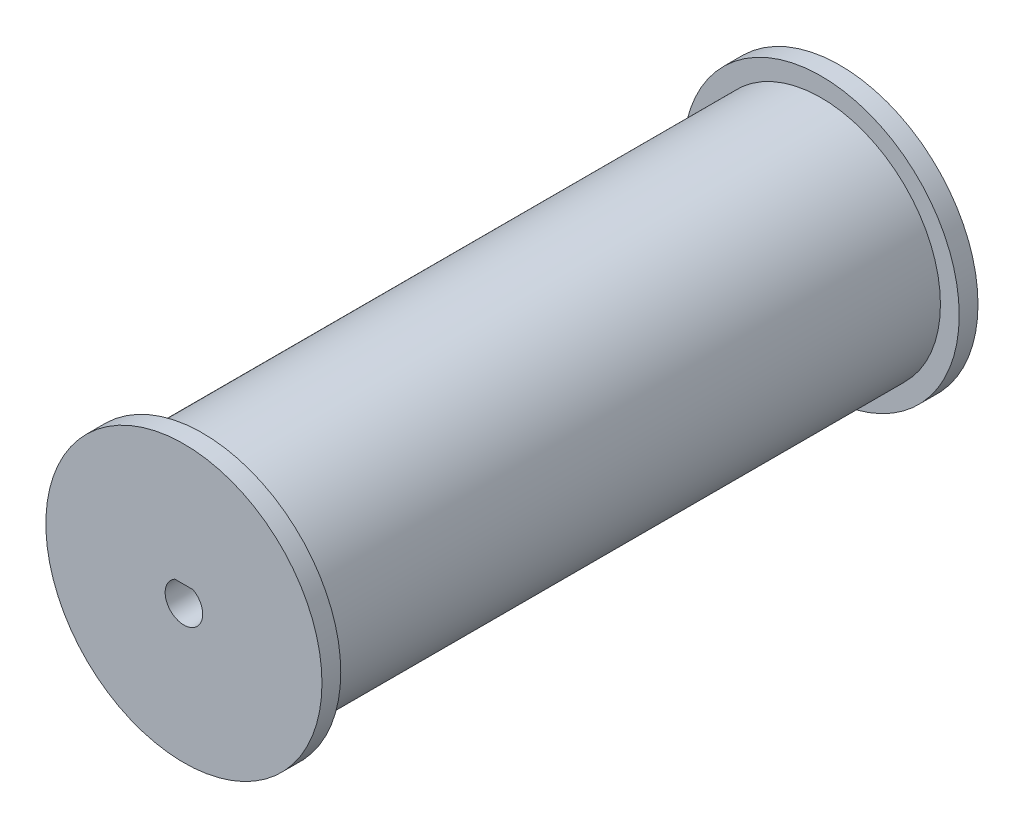
ISO-10303-21;
HEADER;
FILE_DESCRIPTION(('STEP AP214'),'2;1');
FILE_NAME('part.step','',(''),(''),'','','');
FILE_SCHEMA(('AUTOMOTIVE_DESIGN { 1 0 10303 214 1 1 1 1 }'));
ENDSEC;
DATA;
#1=APPLICATION_CONTEXT('core data for automotive mechanical design processes');
#2=APPLICATION_PROTOCOL_DEFINITION('international standard','automotive_design',2000,#1);
#3=PRODUCT_CONTEXT('',#1,'mechanical');
#4=PRODUCT('Part','Part','',(#3));
#5=PRODUCT_RELATED_PRODUCT_CATEGORY('part','',(#4));
#6=PRODUCT_DEFINITION_FORMATION('','',#4);
#7=PRODUCT_DEFINITION_CONTEXT('part definition',#1,'design');
#8=PRODUCT_DEFINITION('design','',#6,#7);
#9=PRODUCT_DEFINITION_SHAPE('','',#8);
#10=(LENGTH_UNIT() NAMED_UNIT(*) SI_UNIT(.MILLI.,.METRE.));
#11=(NAMED_UNIT(*) PLANE_ANGLE_UNIT() SI_UNIT($,.RADIAN.));
#12=(NAMED_UNIT(*) SI_UNIT($,.STERADIAN.) SOLID_ANGLE_UNIT());
#13=UNCERTAINTY_MEASURE_WITH_UNIT(LENGTH_MEASURE(1.E-05),#10,'distance_accuracy_value','');
#14=(GEOMETRIC_REPRESENTATION_CONTEXT(3) GLOBAL_UNCERTAINTY_ASSIGNED_CONTEXT((#13)) GLOBAL_UNIT_ASSIGNED_CONTEXT((#10,
#11,#12)) REPRESENTATION_CONTEXT('',''));
#15=CARTESIAN_POINT('',(0.,0.,0.));
#16=DIRECTION('',(0.,0.,1.));
#17=DIRECTION('',(1.,0.,0.));
#18=AXIS2_PLACEMENT_3D('',#15,#16,#17);
#19=CARTESIAN_POINT('',(0.,0.,69.85));
#20=DIRECTION('',(0.,0.,-1.));
#21=DIRECTION('',(-1.,0.,0.));
#22=AXIS2_PLACEMENT_3D('',#19,#20,#21);
#23=CYLINDRICAL_SURFACE('',#22,12.7);
#24=CARTESIAN_POINT('',(0.,0.,2.));
#25=DIRECTION('',(0.,0.,1.));
#26=DIRECTION('',(1.,0.,0.));
#27=AXIS2_PLACEMENT_3D('',#24,#25,#26);
#28=CIRCLE('',#27,12.7);
#29=CARTESIAN_POINT('',(12.7,0.,2.));
#30=VERTEX_POINT('',#29);
#31=EDGE_CURVE('E89',#30,#30,#28,.T.);
#32=ORIENTED_EDGE('',*,*,#31,.T.);
#33=EDGE_LOOP('',(#32));
#34=FACE_BOUND('',#33,.T.);
#35=CARTESIAN_POINT('',(0.,0.,67.85));
#36=DIRECTION('',(0.,0.,1.));
#37=DIRECTION('',(1.,0.,0.));
#38=AXIS2_PLACEMENT_3D('',#35,#36,#37);
#39=CIRCLE('',#38,12.7);
#40=CARTESIAN_POINT('',(12.7,0.,67.85));
#41=VERTEX_POINT('',#40);
#42=EDGE_CURVE('E12',#41,#41,#39,.T.);
#43=ORIENTED_EDGE('',*,*,#42,.F.);
#44=EDGE_LOOP('',(#43));
#45=FACE_BOUND('',#44,.T.);
#46=ADVANCED_FACE('F41',(#34,#45),#23,.T.);
#47=CARTESIAN_POINT('',(0.,0.,2.));
#48=DIRECTION('',(0.,0.,1.));
#49=DIRECTION('',(1.,0.,0.));
#50=AXIS2_PLACEMENT_3D('',#47,#48,#49);
#51=PLANE('',#50);
#52=CARTESIAN_POINT('',(0.,0.,2.));
#53=DIRECTION('',(0.,0.,1.));
#54=DIRECTION('',(1.,0.,0.));
#55=AXIS2_PLACEMENT_3D('',#52,#53,#54);
#56=CIRCLE('',#55,14.7);
#57=CARTESIAN_POINT('',(14.7,0.,2.));
#58=VERTEX_POINT('',#57);
#59=EDGE_CURVE('E93',#58,#58,#56,.T.);
#60=ORIENTED_EDGE('',*,*,#59,.T.);
#61=EDGE_LOOP('',(#60));
#62=FACE_BOUND('',#61,.T.);
#63=ORIENTED_EDGE('',*,*,#31,.F.);
#64=EDGE_LOOP('',(#63));
#65=FACE_BOUND('',#64,.T.);
#66=ADVANCED_FACE('F117',(#62,#65),#51,.T.);
#67=CARTESIAN_POINT('',(0.,0.,2.));
#68=DIRECTION('',(0.,0.,-1.));
#69=DIRECTION('',(-1.,0.,0.));
#70=AXIS2_PLACEMENT_3D('',#67,#68,#69);
#71=CYLINDRICAL_SURFACE('',#70,14.7);
#72=ORIENTED_EDGE('',*,*,#59,.F.);
#73=EDGE_LOOP('',(#72));
#74=FACE_BOUND('',#73,.T.);
#75=CARTESIAN_POINT('',(0.,0.,0.));
#76=DIRECTION('',(0.,0.,1.));
#77=DIRECTION('',(1.,0.,0.));
#78=AXIS2_PLACEMENT_3D('',#75,#76,#77);
#79=CIRCLE('',#78,14.7);
#80=CARTESIAN_POINT('',(14.7,0.,0.));
#81=VERTEX_POINT('',#80);
#82=EDGE_CURVE('E94',#81,#81,#79,.T.);
#83=ORIENTED_EDGE('',*,*,#82,.T.);
#84=EDGE_LOOP('',(#83));
#85=FACE_BOUND('',#84,.T.);
#86=ADVANCED_FACE('F122',(#74,#85),#71,.T.);
#87=CARTESIAN_POINT('',(0.,0.,34.925));
#88=DIRECTION('',(0.,0.,-1.));
#89=DIRECTION('',(-1.,0.,0.));
#90=AXIS2_PLACEMENT_3D('',#87,#88,#89);
#91=PLANE('',#90);
#92=CARTESIAN_POINT('',(0.,0.,34.925));
#93=DIRECTION('',(0.,0.,-1.));
#94=DIRECTION('',(-1.,0.,0.));
#95=AXIS2_PLACEMENT_3D('',#92,#93,#94);
#96=CIRCLE('',#95,3.571999968);
#97=CARTESIAN_POINT('',(-3.571999968,0.,34.925));
#98=VERTEX_POINT('',#97);
#99=EDGE_CURVE('E79',#98,#98,#96,.T.);
#100=ORIENTED_EDGE('',*,*,#99,.T.);
#101=EDGE_LOOP('',(#100));
#102=FACE_BOUND('',#101,.T.);
#103=ADVANCED_FACE('F130',(#102),#91,.T.);
#104=CARTESIAN_POINT('',(0.,0.,34.925));
#105=DIRECTION('',(0.,0.,-1.));
#106=DIRECTION('',(-1.,0.,0.));
#107=AXIS2_PLACEMENT_3D('',#104,#105,#106);
#108=CYLINDRICAL_SURFACE('',#107,3.571999968);
#109=ORIENTED_EDGE('',*,*,#99,.F.);
#110=EDGE_LOOP('',(#109));
#111=FACE_BOUND('',#110,.T.);
#112=CARTESIAN_POINT('',(0.,0.,0.));
#113=DIRECTION('',(0.,0.,-1.));
#114=DIRECTION('',(-1.,0.,0.));
#115=AXIS2_PLACEMENT_3D('',#112,#113,#114);
#116=CIRCLE('',#115,3.571999968);
#117=CARTESIAN_POINT('',(-3.571999968,0.,0.));
#118=VERTEX_POINT('',#117);
#119=EDGE_CURVE('E82',#118,#118,#116,.T.);
#120=ORIENTED_EDGE('',*,*,#119,.T.);
#121=EDGE_LOOP('',(#120));
#122=FACE_BOUND('',#121,.T.);
#123=ADVANCED_FACE('F137',(#111,#122),#108,.F.);
#124=CARTESIAN_POINT('',(0.,0.,0.));
#125=DIRECTION('',(0.,0.,1.));
#126=DIRECTION('',(1.,0.,0.));
#127=AXIS2_PLACEMENT_3D('',#124,#125,#126);
#128=PLANE('',#127);
#129=ORIENTED_EDGE('',*,*,#119,.F.);
#130=EDGE_LOOP('',(#129));
#131=FACE_BOUND('',#130,.T.);
#132=ORIENTED_EDGE('',*,*,#82,.F.);
#133=EDGE_LOOP('',(#132));
#134=FACE_BOUND('',#133,.T.);
#135=ADVANCED_FACE('F112',(#131,#134),#128,.F.);
#136=CARTESIAN_POINT('',(0.,0.,67.85));
#137=DIRECTION('',(0.,0.,1.));
#138=DIRECTION('',(1.,0.,0.));
#139=AXIS2_PLACEMENT_3D('',#136,#137,#138);
#140=PLANE('',#139);
#141=CARTESIAN_POINT('',(0.,0.,67.85));
#142=DIRECTION('',(0.,0.,1.));
#143=DIRECTION('',(1.,0.,0.));
#144=AXIS2_PLACEMENT_3D('',#141,#142,#143);
#145=CIRCLE('',#144,14.7);
#146=CARTESIAN_POINT('',(14.7,0.,67.85));
#147=VERTEX_POINT('',#146);
#148=EDGE_CURVE('E97',#147,#147,#145,.T.);
#149=ORIENTED_EDGE('',*,*,#148,.F.);
#150=EDGE_LOOP('',(#149));
#151=FACE_BOUND('',#150,.T.);
#152=ORIENTED_EDGE('',*,*,#42,.T.);
#153=EDGE_LOOP('',(#152));
#154=FACE_BOUND('',#153,.T.);
#155=ADVANCED_FACE('F109',(#151,#154),#140,.F.);
#156=CARTESIAN_POINT('',(0.,0.,67.85));
#157=DIRECTION('',(0.,0.,1.));
#158=DIRECTION('',(1.,0.,0.));
#159=AXIS2_PLACEMENT_3D('',#156,#157,#158);
#160=CYLINDRICAL_SURFACE('',#159,14.7);
#161=ORIENTED_EDGE('',*,*,#148,.T.);
#162=EDGE_LOOP('',(#161));
#163=FACE_BOUND('',#162,.T.);
#164=CARTESIAN_POINT('',(0.,0.,69.85));
#165=DIRECTION('',(0.,0.,1.));
#166=DIRECTION('',(1.,0.,0.));
#167=AXIS2_PLACEMENT_3D('',#164,#165,#166);
#168=CIRCLE('',#167,14.7);
#169=CARTESIAN_POINT('',(14.7,0.,69.85));
#170=VERTEX_POINT('',#169);
#171=EDGE_CURVE('E100',#170,#170,#168,.T.);
#172=ORIENTED_EDGE('',*,*,#171,.F.);
#173=EDGE_LOOP('',(#172));
#174=FACE_BOUND('',#173,.T.);
#175=ADVANCED_FACE('F106',(#163,#174),#160,.T.);
#176=CARTESIAN_POINT('',(0.,0.,59.85));
#177=DIRECTION('',(0.,0.,1.));
#178=DIRECTION('',(1.,0.,0.));
#179=AXIS2_PLACEMENT_3D('',#176,#177,#178);
#180=PLANE('',#179);
#181=CARTESIAN_POINT('',(0.,0.,59.85));
#182=DIRECTION('',(0.,0.,1.));
#183=DIRECTION('',(1.,0.,0.));
#184=AXIS2_PLACEMENT_3D('',#181,#182,#183);
#185=CIRCLE('',#184,2.);
#186=CARTESIAN_POINT('',(-0.968245836551854,1.75,59.85));
#187=VERTEX_POINT('',#186);
#188=CARTESIAN_POINT('',(0.968245836551854,1.75,59.85));
#189=VERTEX_POINT('',#188);
#190=EDGE_CURVE('E71',#187,#189,#185,.T.);
#191=ORIENTED_EDGE('',*,*,#190,.T.);
#192=DIRECTION('',(-1.,0.,0.));
#193=VECTOR('',#192,1.);
#194=CARTESIAN_POINT('',(-0.968245836551854,1.75,59.85));
#195=LINE('',#194,#193);
#196=EDGE_CURVE('E85',#189,#187,#195,.T.);
#197=ORIENTED_EDGE('',*,*,#196,.T.);
#198=EDGE_LOOP('',(#191,#197));
#199=FACE_BOUND('',#198,.T.);
#200=ADVANCED_FACE('F142',(#199),#180,.T.);
#201=CARTESIAN_POINT('',(-0.968245836551854,1.75,59.85));
#202=DIRECTION('',(0.,1.,0.));
#203=DIRECTION('',(0.,0.,1.));
#204=AXIS2_PLACEMENT_3D('',#201,#202,#203);
#205=PLANE('',#204);
#206=DIRECTION('',(-1.,0.,0.));
#207=VECTOR('',#206,1.);
#208=CARTESIAN_POINT('',(-0.968245836551854,1.75,69.85));
#209=LINE('',#208,#207);
#210=CARTESIAN_POINT('',(0.968245836551854,1.75,69.85));
#211=VERTEX_POINT('',#210);
#212=CARTESIAN_POINT('',(-0.968245836551854,1.75,69.85));
#213=VERTEX_POINT('',#212);
#214=EDGE_CURVE('E73',#211,#213,#209,.T.);
#215=ORIENTED_EDGE('',*,*,#214,.T.);
#216=DIRECTION('',(0.,0.,1.));
#217=VECTOR('',#216,1.);
#218=CARTESIAN_POINT('',(-0.968245836551854,1.75,59.85));
#219=LINE('',#218,#217);
#220=EDGE_CURVE('E49',#187,#213,#219,.T.);
#221=ORIENTED_EDGE('',*,*,#220,.F.);
#222=ORIENTED_EDGE('',*,*,#196,.F.);
#223=DIRECTION('',(0.,0.,1.));
#224=VECTOR('',#223,1.);
#225=CARTESIAN_POINT('',(0.968245836551854,1.75,59.85));
#226=LINE('',#225,#224);
#227=EDGE_CURVE('E44',#189,#211,#226,.T.);
#228=ORIENTED_EDGE('',*,*,#227,.T.);
#229=EDGE_LOOP('',(#215,#221,#222,#228));
#230=FACE_BOUND('',#229,.T.);
#231=ADVANCED_FACE('F74',(#230),#205,.F.);
#232=CARTESIAN_POINT('',(0.,0.,59.85));
#233=DIRECTION('',(0.,0.,1.));
#234=DIRECTION('',(1.,0.,0.));
#235=AXIS2_PLACEMENT_3D('',#232,#233,#234);
#236=CYLINDRICAL_SURFACE('',#235,2.);
#237=CARTESIAN_POINT('',(0.,0.,69.85));
#238=DIRECTION('',(0.,0.,1.));
#239=DIRECTION('',(1.,0.,0.));
#240=AXIS2_PLACEMENT_3D('',#237,#238,#239);
#241=CIRCLE('',#240,2.);
#242=EDGE_CURVE('E68',#213,#211,#241,.T.);
#243=ORIENTED_EDGE('',*,*,#242,.T.);
#244=ORIENTED_EDGE('',*,*,#227,.F.);
#245=ORIENTED_EDGE('',*,*,#190,.F.);
#246=ORIENTED_EDGE('',*,*,#220,.T.);
#247=EDGE_LOOP('',(#243,#244,#245,#246));
#248=FACE_BOUND('',#247,.T.);
#249=ADVANCED_FACE('F66',(#248),#236,.F.);
#250=CARTESIAN_POINT('',(0.,0.,69.85));
#251=DIRECTION('',(0.,0.,1.));
#252=DIRECTION('',(1.,0.,0.));
#253=AXIS2_PLACEMENT_3D('',#250,#251,#252);
#254=PLANE('',#253);
#255=ORIENTED_EDGE('',*,*,#242,.F.);
#256=ORIENTED_EDGE('',*,*,#214,.F.);
#257=EDGE_LOOP('',(#255,#256));
#258=FACE_BOUND('',#257,.T.);
#259=ORIENTED_EDGE('',*,*,#171,.T.);
#260=EDGE_LOOP('',(#259));
#261=FACE_BOUND('',#260,.T.);
#262=ADVANCED_FACE('F77',(#258,#261),#254,.T.);
#263=CLOSED_SHELL('',(#46,#66,#86,#103,#123,#135,#155,#175,#200,#231,#249,#262));
#264=MANIFOLD_SOLID_BREP('B2',#263);
#265=ADVANCED_BREP_SHAPE_REPRESENTATION('',(#18,#264),#14);
#266=SHAPE_DEFINITION_REPRESENTATION(#9,#265);
ENDSEC;
END-ISO-10303-21;
